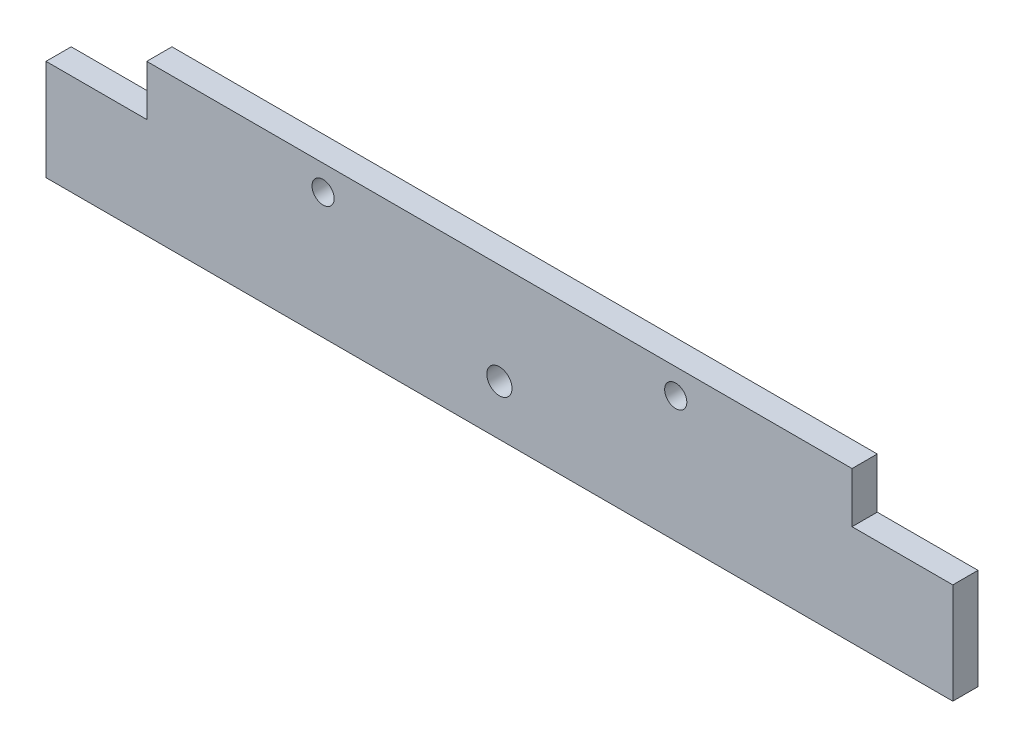
ISO-10303-21;
HEADER;
FILE_DESCRIPTION(('STEP AP214'),'2;1');
FILE_NAME('part.step','',(''),(''),'','','');
FILE_SCHEMA(('AUTOMOTIVE_DESIGN { 1 0 10303 214 1 1 1 1 }'));
ENDSEC;
DATA;
#1=APPLICATION_CONTEXT('core data for automotive mechanical design processes');
#2=APPLICATION_PROTOCOL_DEFINITION('international standard','automotive_design',2000,#1);
#3=PRODUCT_CONTEXT('',#1,'mechanical');
#4=PRODUCT('Part','Part','',(#3));
#5=PRODUCT_RELATED_PRODUCT_CATEGORY('part','',(#4));
#6=PRODUCT_DEFINITION_FORMATION('','',#4);
#7=PRODUCT_DEFINITION_CONTEXT('part definition',#1,'design');
#8=PRODUCT_DEFINITION('design','',#6,#7);
#9=PRODUCT_DEFINITION_SHAPE('','',#8);
#10=(LENGTH_UNIT() NAMED_UNIT(*) SI_UNIT(.MILLI.,.METRE.));
#11=(NAMED_UNIT(*) PLANE_ANGLE_UNIT() SI_UNIT($,.RADIAN.));
#12=(NAMED_UNIT(*) SI_UNIT($,.STERADIAN.) SOLID_ANGLE_UNIT());
#13=UNCERTAINTY_MEASURE_WITH_UNIT(LENGTH_MEASURE(1.E-05),#10,'distance_accuracy_value','');
#14=(GEOMETRIC_REPRESENTATION_CONTEXT(3) GLOBAL_UNCERTAINTY_ASSIGNED_CONTEXT((#13)) GLOBAL_UNIT_ASSIGNED_CONTEXT((#10,
#11,#12)) REPRESENTATION_CONTEXT('',''));
#15=CARTESIAN_POINT('',(0.,0.,0.));
#16=DIRECTION('',(0.,0.,1.));
#17=DIRECTION('',(1.,0.,0.));
#18=AXIS2_PLACEMENT_3D('',#15,#16,#17);
#19=CARTESIAN_POINT('',(140.,-10.,5.));
#20=DIRECTION('',(-1.,0.,0.));
#21=DIRECTION('',(0.,0.,1.));
#22=AXIS2_PLACEMENT_3D('',#19,#20,#21);
#23=PLANE('',#22);
#24=DIRECTION('',(0.,1.,0.));
#25=VECTOR('',#24,1.);
#26=CARTESIAN_POINT('',(140.,-10.,0.));
#27=LINE('',#26,#25);
#28=CARTESIAN_POINT('',(140.,-10.,0.));
#29=VERTEX_POINT('',#28);
#30=CARTESIAN_POINT('',(140.,0.,0.));
#31=VERTEX_POINT('',#30);
#32=EDGE_CURVE('E139',#29,#31,#27,.T.);
#33=ORIENTED_EDGE('',*,*,#32,.T.);
#34=DIRECTION('',(0.,0.,-1.));
#35=VECTOR('',#34,1.);
#36=CARTESIAN_POINT('',(140.,0.,5.));
#37=LINE('',#36,#35);
#38=CARTESIAN_POINT('',(140.,0.,5.));
#39=VERTEX_POINT('',#38);
#40=EDGE_CURVE('E11',#39,#31,#37,.T.);
#41=ORIENTED_EDGE('',*,*,#40,.F.);
#42=DIRECTION('',(0.,1.,0.));
#43=VECTOR('',#42,1.);
#44=CARTESIAN_POINT('',(140.,-10.,5.));
#45=LINE('',#44,#43);
#46=CARTESIAN_POINT('',(140.,-10.,5.));
#47=VERTEX_POINT('',#46);
#48=EDGE_CURVE('E153',#47,#39,#45,.T.);
#49=ORIENTED_EDGE('',*,*,#48,.F.);
#50=DIRECTION('',(0.,0.,-1.));
#51=VECTOR('',#50,1.);
#52=CARTESIAN_POINT('',(140.,-10.,5.));
#53=LINE('',#52,#51);
#54=EDGE_CURVE('E135',#47,#29,#53,.T.);
#55=ORIENTED_EDGE('',*,*,#54,.T.);
#56=EDGE_LOOP('',(#33,#41,#49,#55));
#57=FACE_BOUND('',#56,.T.);
#58=ADVANCED_FACE('F41',(#57),#23,.F.);
#59=CARTESIAN_POINT('',(0.,0.,5.));
#60=DIRECTION('',(0.,-1.,0.));
#61=DIRECTION('',(1.,0.,0.));
#62=AXIS2_PLACEMENT_3D('',#59,#60,#61);
#63=PLANE('',#62);
#64=DIRECTION('',(-1.,0.,0.));
#65=VECTOR('',#64,1.);
#66=CARTESIAN_POINT('',(0.,0.,0.));
#67=LINE('',#66,#65);
#68=CARTESIAN_POINT('',(0.,0.,0.));
#69=VERTEX_POINT('',#68);
#70=EDGE_CURVE('E142',#31,#69,#67,.T.);
#71=ORIENTED_EDGE('',*,*,#70,.T.);
#72=DIRECTION('',(0.,0.,-1.));
#73=VECTOR('',#72,1.);
#74=CARTESIAN_POINT('',(0.,0.,5.));
#75=LINE('',#74,#73);
#76=CARTESIAN_POINT('',(0.,0.,5.));
#77=VERTEX_POINT('',#76);
#78=EDGE_CURVE('E50',#77,#69,#75,.T.);
#79=ORIENTED_EDGE('',*,*,#78,.F.);
#80=DIRECTION('',(-1.,0.,0.));
#81=VECTOR('',#80,1.);
#82=CARTESIAN_POINT('',(0.,0.,5.));
#83=LINE('',#82,#81);
#84=EDGE_CURVE('E102',#39,#77,#83,.T.);
#85=ORIENTED_EDGE('',*,*,#84,.F.);
#86=ORIENTED_EDGE('',*,*,#40,.T.);
#87=EDGE_LOOP('',(#71,#79,#85,#86));
#88=FACE_BOUND('',#87,.T.);
#89=ADVANCED_FACE('F217',(#88),#63,.F.);
#90=CARTESIAN_POINT('',(0.,-10.,5.));
#91=DIRECTION('',(1.,0.,0.));
#92=DIRECTION('',(0.,1.,0.));
#93=AXIS2_PLACEMENT_3D('',#90,#91,#92);
#94=PLANE('',#93);
#95=DIRECTION('',(0.,-1.,0.));
#96=VECTOR('',#95,1.);
#97=CARTESIAN_POINT('',(0.,-10.,0.));
#98=LINE('',#97,#96);
#99=CARTESIAN_POINT('',(0.,-10.,0.));
#100=VERTEX_POINT('',#99);
#101=EDGE_CURVE('E144',#69,#100,#98,.T.);
#102=ORIENTED_EDGE('',*,*,#101,.T.);
#103=DIRECTION('',(0.,0.,-1.));
#104=VECTOR('',#103,1.);
#105=CARTESIAN_POINT('',(0.,-10.,5.));
#106=LINE('',#105,#104);
#107=CARTESIAN_POINT('',(0.,-10.,5.));
#108=VERTEX_POINT('',#107);
#109=EDGE_CURVE('E160',#108,#100,#106,.T.);
#110=ORIENTED_EDGE('',*,*,#109,.F.);
#111=DIRECTION('',(0.,-1.,0.));
#112=VECTOR('',#111,1.);
#113=CARTESIAN_POINT('',(0.,-10.,5.));
#114=LINE('',#113,#112);
#115=EDGE_CURVE('E184',#77,#108,#114,.T.);
#116=ORIENTED_EDGE('',*,*,#115,.F.);
#117=ORIENTED_EDGE('',*,*,#78,.T.);
#118=EDGE_LOOP('',(#102,#110,#116,#117));
#119=FACE_BOUND('',#118,.T.);
#120=ADVANCED_FACE('F221',(#119),#94,.F.);
#121=CARTESIAN_POINT('',(0.,-10.,5.));
#122=DIRECTION('',(0.,-1.,0.));
#123=DIRECTION('',(1.,0.,0.));
#124=AXIS2_PLACEMENT_3D('',#121,#122,#123);
#125=PLANE('',#124);
#126=DIRECTION('',(-1.,0.,0.));
#127=VECTOR('',#126,1.);
#128=CARTESIAN_POINT('',(0.,-10.,0.));
#129=LINE('',#128,#127);
#130=CARTESIAN_POINT('',(-20.,-10.,0.));
#131=VERTEX_POINT('',#130);
#132=EDGE_CURVE('E146',#100,#131,#129,.T.);
#133=ORIENTED_EDGE('',*,*,#132,.T.);
#134=DIRECTION('',(0.,0.,-1.));
#135=VECTOR('',#134,1.);
#136=CARTESIAN_POINT('',(-20.,-10.,5.));
#137=LINE('',#136,#135);
#138=CARTESIAN_POINT('',(-20.,-10.,5.));
#139=VERTEX_POINT('',#138);
#140=EDGE_CURVE('E157',#139,#131,#137,.T.);
#141=ORIENTED_EDGE('',*,*,#140,.F.);
#142=DIRECTION('',(-1.,0.,0.));
#143=VECTOR('',#142,1.);
#144=CARTESIAN_POINT('',(0.,-10.,5.));
#145=LINE('',#144,#143);
#146=EDGE_CURVE('E186',#108,#139,#145,.T.);
#147=ORIENTED_EDGE('',*,*,#146,.F.);
#148=ORIENTED_EDGE('',*,*,#109,.T.);
#149=EDGE_LOOP('',(#133,#141,#147,#148));
#150=FACE_BOUND('',#149,.T.);
#151=ADVANCED_FACE('F192',(#150),#125,.F.);
#152=CARTESIAN_POINT('',(-20.,-10.,5.));
#153=DIRECTION('',(1.,0.,0.));
#154=DIRECTION('',(0.,1.,0.));
#155=AXIS2_PLACEMENT_3D('',#152,#153,#154);
#156=PLANE('',#155);
#157=DIRECTION('',(0.,-1.,0.));
#158=VECTOR('',#157,1.);
#159=CARTESIAN_POINT('',(-20.,-10.,0.));
#160=LINE('',#159,#158);
#161=CARTESIAN_POINT('',(-20.,-30.,0.));
#162=VERTEX_POINT('',#161);
#163=EDGE_CURVE('E148',#131,#162,#160,.T.);
#164=ORIENTED_EDGE('',*,*,#163,.T.);
#165=DIRECTION('',(0.,0.,-1.));
#166=VECTOR('',#165,1.);
#167=CARTESIAN_POINT('',(-20.,-30.,5.));
#168=LINE('',#167,#166);
#169=CARTESIAN_POINT('',(-20.,-30.,5.));
#170=VERTEX_POINT('',#169);
#171=EDGE_CURVE('E130',#170,#162,#168,.T.);
#172=ORIENTED_EDGE('',*,*,#171,.F.);
#173=DIRECTION('',(0.,-1.,0.));
#174=VECTOR('',#173,1.);
#175=CARTESIAN_POINT('',(-20.,-10.,5.));
#176=LINE('',#175,#174);
#177=EDGE_CURVE('E121',#139,#170,#176,.T.);
#178=ORIENTED_EDGE('',*,*,#177,.F.);
#179=ORIENTED_EDGE('',*,*,#140,.T.);
#180=EDGE_LOOP('',(#164,#172,#178,#179));
#181=FACE_BOUND('',#180,.T.);
#182=ADVANCED_FACE('F196',(#181),#156,.F.);
#183=CARTESIAN_POINT('',(-20.,-30.,5.));
#184=DIRECTION('',(0.,1.,0.));
#185=DIRECTION('',(-1.,0.,0.));
#186=AXIS2_PLACEMENT_3D('',#183,#184,#185);
#187=PLANE('',#186);
#188=DIRECTION('',(1.,0.,0.));
#189=VECTOR('',#188,1.);
#190=CARTESIAN_POINT('',(-20.,-30.,0.));
#191=LINE('',#190,#189);
#192=CARTESIAN_POINT('',(160.,-30.,0.));
#193=VERTEX_POINT('',#192);
#194=EDGE_CURVE('E129',#162,#193,#191,.T.);
#195=ORIENTED_EDGE('',*,*,#194,.T.);
#196=DIRECTION('',(0.,0.,-1.));
#197=VECTOR('',#196,1.);
#198=CARTESIAN_POINT('',(160.,-30.,5.));
#199=LINE('',#198,#197);
#200=CARTESIAN_POINT('',(160.,-30.,5.));
#201=VERTEX_POINT('',#200);
#202=EDGE_CURVE('E126',#201,#193,#199,.T.);
#203=ORIENTED_EDGE('',*,*,#202,.F.);
#204=DIRECTION('',(1.,0.,0.));
#205=VECTOR('',#204,1.);
#206=CARTESIAN_POINT('',(-20.,-30.,5.));
#207=LINE('',#206,#205);
#208=EDGE_CURVE('E115',#170,#201,#207,.T.);
#209=ORIENTED_EDGE('',*,*,#208,.F.);
#210=ORIENTED_EDGE('',*,*,#171,.T.);
#211=EDGE_LOOP('',(#195,#203,#209,#210));
#212=FACE_BOUND('',#211,.T.);
#213=ADVANCED_FACE('F127',(#212),#187,.F.);
#214=CARTESIAN_POINT('',(160.,-30.,5.));
#215=DIRECTION('',(-1.,0.,0.));
#216=DIRECTION('',(0.,0.,1.));
#217=AXIS2_PLACEMENT_3D('',#214,#215,#216);
#218=PLANE('',#217);
#219=DIRECTION('',(0.,1.,0.));
#220=VECTOR('',#219,1.);
#221=CARTESIAN_POINT('',(160.,-30.,0.));
#222=LINE('',#221,#220);
#223=CARTESIAN_POINT('',(160.,-10.,0.));
#224=VERTEX_POINT('',#223);
#225=EDGE_CURVE('E88',#193,#224,#222,.T.);
#226=ORIENTED_EDGE('',*,*,#225,.T.);
#227=DIRECTION('',(0.,0.,-1.));
#228=VECTOR('',#227,1.);
#229=CARTESIAN_POINT('',(160.,-10.,5.));
#230=LINE('',#229,#228);
#231=CARTESIAN_POINT('',(160.,-10.,5.));
#232=VERTEX_POINT('',#231);
#233=EDGE_CURVE('E131',#232,#224,#230,.T.);
#234=ORIENTED_EDGE('',*,*,#233,.F.);
#235=DIRECTION('',(0.,1.,0.));
#236=VECTOR('',#235,1.);
#237=CARTESIAN_POINT('',(160.,-30.,5.));
#238=LINE('',#237,#236);
#239=EDGE_CURVE('E119',#201,#232,#238,.T.);
#240=ORIENTED_EDGE('',*,*,#239,.F.);
#241=ORIENTED_EDGE('',*,*,#202,.T.);
#242=EDGE_LOOP('',(#226,#234,#240,#241));
#243=FACE_BOUND('',#242,.T.);
#244=ADVANCED_FACE('F133',(#243),#218,.F.);
#245=CARTESIAN_POINT('',(160.,-10.,5.));
#246=DIRECTION('',(0.,-1.,0.));
#247=DIRECTION('',(1.,0.,0.));
#248=AXIS2_PLACEMENT_3D('',#245,#246,#247);
#249=PLANE('',#248);
#250=DIRECTION('',(-1.,0.,0.));
#251=VECTOR('',#250,1.);
#252=CARTESIAN_POINT('',(160.,-10.,0.));
#253=LINE('',#252,#251);
#254=EDGE_CURVE('E94',#224,#29,#253,.T.);
#255=ORIENTED_EDGE('',*,*,#254,.T.);
#256=ORIENTED_EDGE('',*,*,#54,.F.);
#257=DIRECTION('',(-1.,0.,0.));
#258=VECTOR('',#257,1.);
#259=CARTESIAN_POINT('',(160.,-10.,5.));
#260=LINE('',#259,#258);
#261=EDGE_CURVE('E59',#232,#47,#260,.T.);
#262=ORIENTED_EDGE('',*,*,#261,.F.);
#263=ORIENTED_EDGE('',*,*,#233,.T.);
#264=EDGE_LOOP('',(#255,#256,#262,#263));
#265=FACE_BOUND('',#264,.T.);
#266=ADVANCED_FACE('F204',(#265),#249,.F.);
#267=CARTESIAN_POINT('',(0.,0.,5.));
#268=DIRECTION('',(0.,0.,-1.));
#269=DIRECTION('',(-1.,0.,0.));
#270=AXIS2_PLACEMENT_3D('',#267,#268,#269);
#271=PLANE('',#270);
#272=CARTESIAN_POINT('',(70.,-20.,5.));
#273=DIRECTION('',(0.,0.,1.));
#274=DIRECTION('',(1.,0.,0.));
#275=AXIS2_PLACEMENT_3D('',#272,#273,#274);
#276=CIRCLE('',#275,2.5);
#277=CARTESIAN_POINT('',(72.5,-20.,5.));
#278=VERTEX_POINT('',#277);
#279=EDGE_CURVE('E179',#278,#278,#276,.T.);
#280=ORIENTED_EDGE('',*,*,#279,.F.);
#281=EDGE_LOOP('',(#280));
#282=FACE_BOUND('',#281,.T.);
#283=CARTESIAN_POINT('',(35.,-5.,5.));
#284=DIRECTION('',(0.,0.,1.));
#285=DIRECTION('',(1.,0.,0.));
#286=AXIS2_PLACEMENT_3D('',#283,#284,#285);
#287=CIRCLE('',#286,2.2);
#288=CARTESIAN_POINT('',(37.2,-5.,5.));
#289=VERTEX_POINT('',#288);
#290=EDGE_CURVE('E166',#289,#289,#287,.T.);
#291=ORIENTED_EDGE('',*,*,#290,.F.);
#292=EDGE_LOOP('',(#291));
#293=FACE_BOUND('',#292,.T.);
#294=CARTESIAN_POINT('',(105.,-5.,5.));
#295=DIRECTION('',(0.,0.,1.));
#296=DIRECTION('',(1.,0.,0.));
#297=AXIS2_PLACEMENT_3D('',#294,#295,#296);
#298=CIRCLE('',#297,2.2);
#299=CARTESIAN_POINT('',(107.2,-5.,5.));
#300=VERTEX_POINT('',#299);
#301=EDGE_CURVE('E171',#300,#300,#298,.T.);
#302=ORIENTED_EDGE('',*,*,#301,.F.);
#303=EDGE_LOOP('',(#302));
#304=FACE_BOUND('',#303,.T.);
#305=ORIENTED_EDGE('',*,*,#48,.T.);
#306=ORIENTED_EDGE('',*,*,#84,.T.);
#307=ORIENTED_EDGE('',*,*,#115,.T.);
#308=ORIENTED_EDGE('',*,*,#146,.T.);
#309=ORIENTED_EDGE('',*,*,#177,.T.);
#310=ORIENTED_EDGE('',*,*,#208,.T.);
#311=ORIENTED_EDGE('',*,*,#239,.T.);
#312=ORIENTED_EDGE('',*,*,#261,.T.);
#313=EDGE_LOOP('',(#305,#306,#307,#308,#309,#310,#311,#312));
#314=FACE_BOUND('',#313,.T.);
#315=ADVANCED_FACE('F117',(#282,#293,#304,#314),#271,.F.);
#316=CARTESIAN_POINT('',(0.,0.,0.));
#317=DIRECTION('',(0.,0.,-1.));
#318=DIRECTION('',(-1.,0.,0.));
#319=AXIS2_PLACEMENT_3D('',#316,#317,#318);
#320=PLANE('',#319);
#321=CARTESIAN_POINT('',(70.,-20.,0.));
#322=DIRECTION('',(0.,0.,1.));
#323=DIRECTION('',(1.,0.,0.));
#324=AXIS2_PLACEMENT_3D('',#321,#322,#323);
#325=CIRCLE('',#324,2.5);
#326=CARTESIAN_POINT('',(72.5,-20.,0.));
#327=VERTEX_POINT('',#326);
#328=EDGE_CURVE('E176',#327,#327,#325,.T.);
#329=ORIENTED_EDGE('',*,*,#328,.T.);
#330=EDGE_LOOP('',(#329));
#331=FACE_BOUND('',#330,.T.);
#332=CARTESIAN_POINT('',(35.,-5.,0.));
#333=DIRECTION('',(0.,0.,-1.));
#334=DIRECTION('',(-1.,0.,0.));
#335=AXIS2_PLACEMENT_3D('',#332,#333,#334);
#336=CIRCLE('',#335,2.2);
#337=CARTESIAN_POINT('',(32.8,-5.,0.));
#338=VERTEX_POINT('',#337);
#339=EDGE_CURVE('E44',#338,#338,#336,.T.);
#340=ORIENTED_EDGE('',*,*,#339,.F.);
#341=EDGE_LOOP('',(#340));
#342=FACE_BOUND('',#341,.T.);
#343=CARTESIAN_POINT('',(105.,-5.,0.));
#344=DIRECTION('',(0.,0.,-1.));
#345=DIRECTION('',(-1.,0.,0.));
#346=AXIS2_PLACEMENT_3D('',#343,#344,#345);
#347=CIRCLE('',#346,2.2);
#348=CARTESIAN_POINT('',(102.8,-5.,0.));
#349=VERTEX_POINT('',#348);
#350=EDGE_CURVE('E164',#349,#349,#347,.T.);
#351=ORIENTED_EDGE('',*,*,#350,.F.);
#352=EDGE_LOOP('',(#351));
#353=FACE_BOUND('',#352,.T.);
#354=ORIENTED_EDGE('',*,*,#32,.F.);
#355=ORIENTED_EDGE('',*,*,#254,.F.);
#356=ORIENTED_EDGE('',*,*,#225,.F.);
#357=ORIENTED_EDGE('',*,*,#194,.F.);
#358=ORIENTED_EDGE('',*,*,#163,.F.);
#359=ORIENTED_EDGE('',*,*,#132,.F.);
#360=ORIENTED_EDGE('',*,*,#101,.F.);
#361=ORIENTED_EDGE('',*,*,#70,.F.);
#362=EDGE_LOOP('',(#354,#355,#356,#357,#358,#359,#360,#361));
#363=FACE_BOUND('',#362,.T.);
#364=ADVANCED_FACE('F199',(#331,#342,#353,#363),#320,.T.);
#365=CARTESIAN_POINT('',(105.,-5.,-5.));
#366=DIRECTION('',(0.,0.,1.));
#367=DIRECTION('',(1.,0.,0.));
#368=AXIS2_PLACEMENT_3D('',#365,#366,#367);
#369=CYLINDRICAL_SURFACE('',#368,2.2);
#370=ORIENTED_EDGE('',*,*,#350,.T.);
#371=EDGE_LOOP('',(#370));
#372=FACE_BOUND('',#371,.T.);
#373=ORIENTED_EDGE('',*,*,#301,.T.);
#374=EDGE_LOOP('',(#373));
#375=FACE_BOUND('',#374,.T.);
#376=ADVANCED_FACE('F263',(#372,#375),#369,.F.);
#377=CARTESIAN_POINT('',(35.,-5.,-5.));
#378=DIRECTION('',(0.,0.,1.));
#379=DIRECTION('',(1.,0.,0.));
#380=AXIS2_PLACEMENT_3D('',#377,#378,#379);
#381=CYLINDRICAL_SURFACE('',#380,2.2);
#382=ORIENTED_EDGE('',*,*,#339,.T.);
#383=EDGE_LOOP('',(#382));
#384=FACE_BOUND('',#383,.T.);
#385=ORIENTED_EDGE('',*,*,#290,.T.);
#386=EDGE_LOOP('',(#385));
#387=FACE_BOUND('',#386,.T.);
#388=ADVANCED_FACE('F272',(#384,#387),#381,.F.);
#389=CARTESIAN_POINT('',(70.,-20.,0.));
#390=DIRECTION('',(0.,0.,1.));
#391=DIRECTION('',(1.,0.,0.));
#392=AXIS2_PLACEMENT_3D('',#389,#390,#391);
#393=CYLINDRICAL_SURFACE('',#392,2.5);
#394=ORIENTED_EDGE('',*,*,#328,.F.);
#395=EDGE_LOOP('',(#394));
#396=FACE_BOUND('',#395,.T.);
#397=ORIENTED_EDGE('',*,*,#279,.T.);
#398=EDGE_LOOP('',(#397));
#399=FACE_BOUND('',#398,.T.);
#400=ADVANCED_FACE('F280',(#396,#399),#393,.F.);
#401=CLOSED_SHELL('',(#58,#89,#120,#151,#182,#213,#244,#266,#315,#364,#376,#388,#400));
#402=MANIFOLD_SOLID_BREP('B2',#401);
#403=ADVANCED_BREP_SHAPE_REPRESENTATION('',(#18,#402),#14);
#404=SHAPE_DEFINITION_REPRESENTATION(#9,#403);
ENDSEC;
END-ISO-10303-21;
